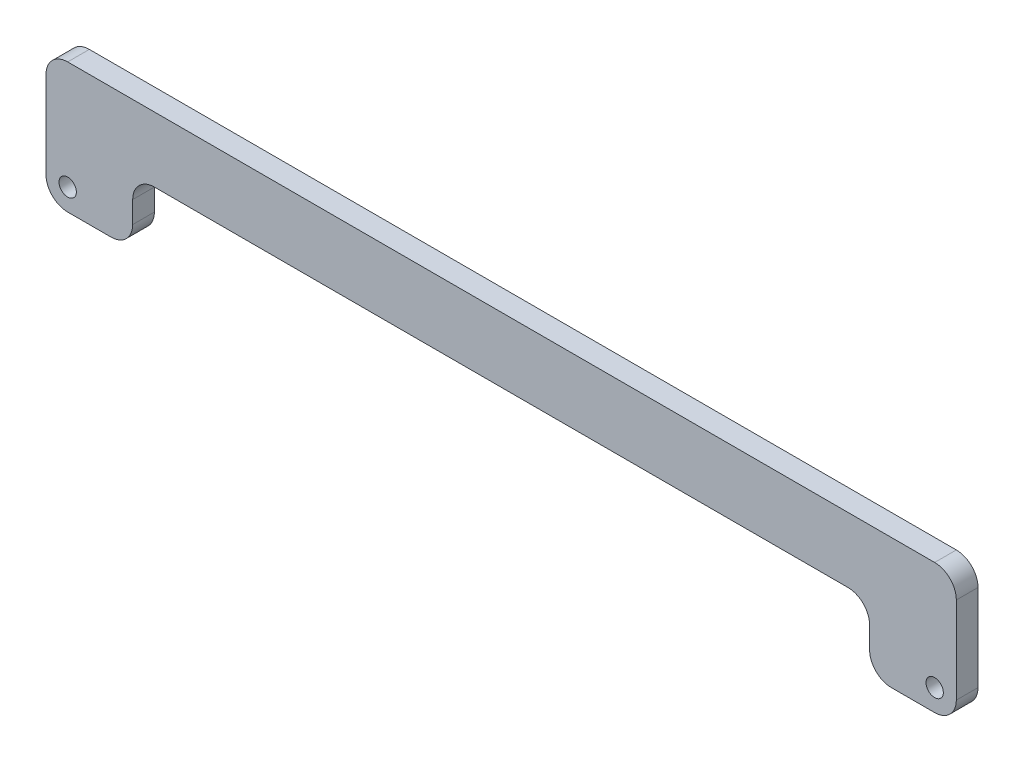
ISO-10303-21;
HEADER;
FILE_DESCRIPTION(('STEP AP214'),'2;1');
FILE_NAME('part.step','',(''),(''),'','','');
FILE_SCHEMA(('AUTOMOTIVE_DESIGN { 1 0 10303 214 1 1 1 1 }'));
ENDSEC;
DATA;
#1=APPLICATION_CONTEXT('core data for automotive mechanical design processes');
#2=APPLICATION_PROTOCOL_DEFINITION('international standard','automotive_design',2000,#1);
#3=PRODUCT_CONTEXT('',#1,'mechanical');
#4=PRODUCT('Part','Part','',(#3));
#5=PRODUCT_RELATED_PRODUCT_CATEGORY('part','',(#4));
#6=PRODUCT_DEFINITION_FORMATION('','',#4);
#7=PRODUCT_DEFINITION_CONTEXT('part definition',#1,'design');
#8=PRODUCT_DEFINITION('design','',#6,#7);
#9=PRODUCT_DEFINITION_SHAPE('','',#8);
#10=(LENGTH_UNIT() NAMED_UNIT(*) SI_UNIT(.MILLI.,.METRE.));
#11=(NAMED_UNIT(*) PLANE_ANGLE_UNIT() SI_UNIT($,.RADIAN.));
#12=(NAMED_UNIT(*) SI_UNIT($,.STERADIAN.) SOLID_ANGLE_UNIT());
#13=UNCERTAINTY_MEASURE_WITH_UNIT(LENGTH_MEASURE(1.E-05),#10,'distance_accuracy_value','');
#14=(GEOMETRIC_REPRESENTATION_CONTEXT(3) GLOBAL_UNCERTAINTY_ASSIGNED_CONTEXT((#13)) GLOBAL_UNIT_ASSIGNED_CONTEXT((#10,
#11,#12)) REPRESENTATION_CONTEXT('',''));
#15=CARTESIAN_POINT('',(0.,0.,0.));
#16=DIRECTION('',(0.,0.,1.));
#17=DIRECTION('',(1.,0.,0.));
#18=AXIS2_PLACEMENT_3D('',#15,#16,#17);
#19=CARTESIAN_POINT('',(0.,0.,5.));
#20=DIRECTION('',(0.,0.,-1.));
#21=DIRECTION('',(-1.,0.,0.));
#22=AXIS2_PLACEMENT_3D('',#19,#20,#21);
#23=PLANE('',#22);
#24=DIRECTION('',(0.,-1.,0.));
#25=VECTOR('',#24,1.);
#26=CARTESIAN_POINT('',(0.,0.,5.));
#27=LINE('',#26,#25);
#28=CARTESIAN_POINT('',(0.,25.,5.));
#29=VERTEX_POINT('',#28);
#30=CARTESIAN_POINT('',(0.,5.,5.));
#31=VERTEX_POINT('',#30);
#32=EDGE_CURVE('E192',#29,#31,#27,.T.);
#33=ORIENTED_EDGE('',*,*,#32,.T.);
#34=CARTESIAN_POINT('',(5.,5.,5.));
#35=DIRECTION('',(0.,0.,-1.));
#36=DIRECTION('',(-1.,0.,0.));
#37=AXIS2_PLACEMENT_3D('',#34,#35,#36);
#38=CIRCLE('',#37,5.);
#39=CARTESIAN_POINT('',(5.,0.,5.));
#40=VERTEX_POINT('',#39);
#41=EDGE_CURVE('E237',#31,#40,#38,.F.);
#42=ORIENTED_EDGE('',*,*,#41,.T.);
#43=DIRECTION('',(1.,0.,0.));
#44=VECTOR('',#43,1.);
#45=CARTESIAN_POINT('',(20.,0.,5.));
#46=LINE('',#45,#44);
#47=CARTESIAN_POINT('',(15.,0.,5.));
#48=VERTEX_POINT('',#47);
#49=EDGE_CURVE('E174',#40,#48,#46,.T.);
#50=ORIENTED_EDGE('',*,*,#49,.T.);
#51=CARTESIAN_POINT('',(15.,5.,5.));
#52=DIRECTION('',(0.,0.,-1.));
#53=DIRECTION('',(-1.,0.,0.));
#54=AXIS2_PLACEMENT_3D('',#51,#52,#53);
#55=CIRCLE('',#54,5.);
#56=CARTESIAN_POINT('',(20.,5.,5.));
#57=VERTEX_POINT('',#56);
#58=EDGE_CURVE('E234',#48,#57,#55,.F.);
#59=ORIENTED_EDGE('',*,*,#58,.T.);
#60=DIRECTION('',(0.,1.,0.));
#61=VECTOR('',#60,1.);
#62=CARTESIAN_POINT('',(20.,15.,5.));
#63=LINE('',#62,#61);
#64=CARTESIAN_POINT('',(20.,9.99999999999998,5.));
#65=VERTEX_POINT('',#64);
#66=EDGE_CURVE('E288',#57,#65,#63,.T.);
#67=ORIENTED_EDGE('',*,*,#66,.T.);
#68=CARTESIAN_POINT('',(25.,9.99999999999998,5.));
#69=DIRECTION('',(0.,0.,-1.));
#70=DIRECTION('',(-1.,0.,0.));
#71=AXIS2_PLACEMENT_3D('',#68,#69,#70);
#72=CIRCLE('',#71,5.);
#73=CARTESIAN_POINT('',(25.,15.,5.));
#74=VERTEX_POINT('',#73);
#75=EDGE_CURVE('E271',#65,#74,#72,.T.);
#76=ORIENTED_EDGE('',*,*,#75,.T.);
#77=DIRECTION('',(1.,0.,0.));
#78=VECTOR('',#77,1.);
#79=CARTESIAN_POINT('',(190.,15.,5.));
#80=LINE('',#79,#78);
#81=CARTESIAN_POINT('',(185.,15.,5.));
#82=VERTEX_POINT('',#81);
#83=EDGE_CURVE('E282',#74,#82,#80,.T.);
#84=ORIENTED_EDGE('',*,*,#83,.T.);
#85=CARTESIAN_POINT('',(185.,10.,5.));
#86=DIRECTION('',(0.,0.,-1.));
#87=DIRECTION('',(-1.,0.,0.));
#88=AXIS2_PLACEMENT_3D('',#85,#86,#87);
#89=CIRCLE('',#88,5.);
#90=CARTESIAN_POINT('',(190.,9.99999999999999,5.));
#91=VERTEX_POINT('',#90);
#92=EDGE_CURVE('E12',#82,#91,#89,.T.);
#93=ORIENTED_EDGE('',*,*,#92,.T.);
#94=DIRECTION('',(0.,-1.,0.));
#95=VECTOR('',#94,1.);
#96=CARTESIAN_POINT('',(190.,0.,5.));
#97=LINE('',#96,#95);
#98=CARTESIAN_POINT('',(190.,5.,5.));
#99=VERTEX_POINT('',#98);
#100=EDGE_CURVE('E287',#91,#99,#97,.T.);
#101=ORIENTED_EDGE('',*,*,#100,.T.);
#102=CARTESIAN_POINT('',(195.,5.,5.));
#103=DIRECTION('',(0.,0.,-1.));
#104=DIRECTION('',(-1.,0.,0.));
#105=AXIS2_PLACEMENT_3D('',#102,#103,#104);
#106=CIRCLE('',#105,5.);
#107=CARTESIAN_POINT('',(195.,0.,5.));
#108=VERTEX_POINT('',#107);
#109=EDGE_CURVE('E228',#99,#108,#106,.F.);
#110=ORIENTED_EDGE('',*,*,#109,.T.);
#111=DIRECTION('',(1.,0.,0.));
#112=VECTOR('',#111,1.);
#113=CARTESIAN_POINT('',(210.,0.,5.));
#114=LINE('',#113,#112);
#115=CARTESIAN_POINT('',(205.,0.,5.));
#116=VERTEX_POINT('',#115);
#117=EDGE_CURVE('E295',#108,#116,#114,.T.);
#118=ORIENTED_EDGE('',*,*,#117,.T.);
#119=CARTESIAN_POINT('',(205.,5.,5.));
#120=DIRECTION('',(0.,0.,-1.));
#121=DIRECTION('',(-1.,0.,0.));
#122=AXIS2_PLACEMENT_3D('',#119,#120,#121);
#123=CIRCLE('',#122,5.);
#124=CARTESIAN_POINT('',(210.,5.,5.));
#125=VERTEX_POINT('',#124);
#126=EDGE_CURVE('E231',#116,#125,#123,.F.);
#127=ORIENTED_EDGE('',*,*,#126,.T.);
#128=DIRECTION('',(0.,1.,0.));
#129=VECTOR('',#128,1.);
#130=CARTESIAN_POINT('',(210.,0.,5.));
#131=LINE('',#130,#129);
#132=CARTESIAN_POINT('',(210.,25.,5.));
#133=VERTEX_POINT('',#132);
#134=EDGE_CURVE('E301',#125,#133,#131,.T.);
#135=ORIENTED_EDGE('',*,*,#134,.T.);
#136=CARTESIAN_POINT('',(205.,25.,5.));
#137=DIRECTION('',(0.,0.,-1.));
#138=DIRECTION('',(-1.,0.,0.));
#139=AXIS2_PLACEMENT_3D('',#136,#137,#138);
#140=CIRCLE('',#139,5.);
#141=CARTESIAN_POINT('',(205.,30.,5.));
#142=VERTEX_POINT('',#141);
#143=EDGE_CURVE('E62',#133,#142,#140,.F.);
#144=ORIENTED_EDGE('',*,*,#143,.T.);
#145=DIRECTION('',(-1.,0.,0.));
#146=VECTOR('',#145,1.);
#147=CARTESIAN_POINT('',(0.,30.,5.));
#148=LINE('',#147,#146);
#149=CARTESIAN_POINT('',(5.,30.,5.));
#150=VERTEX_POINT('',#149);
#151=EDGE_CURVE('E304',#142,#150,#148,.T.);
#152=ORIENTED_EDGE('',*,*,#151,.T.);
#153=CARTESIAN_POINT('',(5.,25.,5.));
#154=DIRECTION('',(0.,0.,-1.));
#155=DIRECTION('',(-1.,0.,0.));
#156=AXIS2_PLACEMENT_3D('',#153,#154,#155);
#157=CIRCLE('',#156,5.);
#158=EDGE_CURVE('E223',#150,#29,#157,.F.);
#159=ORIENTED_EDGE('',*,*,#158,.T.);
#160=EDGE_LOOP('',(#33,#42,#50,#59,#67,#76,#84,#93,#101,#110,#118,#127,#135,#144,#152,#159));
#161=FACE_BOUND('',#160,.T.);
#162=CARTESIAN_POINT('',(5.,5.,5.));
#163=DIRECTION('',(0.,0.,1.));
#164=DIRECTION('',(1.,0.,0.));
#165=AXIS2_PLACEMENT_3D('',#162,#163,#164);
#166=CIRCLE('',#165,2.);
#167=CARTESIAN_POINT('',(7.,5.,5.));
#168=VERTEX_POINT('',#167);
#169=EDGE_CURVE('E182',#168,#168,#166,.T.);
#170=ORIENTED_EDGE('',*,*,#169,.F.);
#171=EDGE_LOOP('',(#170));
#172=FACE_BOUND('',#171,.T.);
#173=CARTESIAN_POINT('',(205.,5.,5.));
#174=DIRECTION('',(0.,0.,1.));
#175=DIRECTION('',(1.,0.,0.));
#176=AXIS2_PLACEMENT_3D('',#173,#174,#175);
#177=CIRCLE('',#176,2.);
#178=CARTESIAN_POINT('',(207.,5.,5.));
#179=VERTEX_POINT('',#178);
#180=EDGE_CURVE('E373',#179,#179,#177,.T.);
#181=ORIENTED_EDGE('',*,*,#180,.F.);
#182=EDGE_LOOP('',(#181));
#183=FACE_BOUND('',#182,.T.);
#184=ADVANCED_FACE('F38',(#161,#172,#183),#23,.F.);
#185=CARTESIAN_POINT('',(0.,0.,0.));
#186=DIRECTION('',(0.,0.,-1.));
#187=DIRECTION('',(-1.,0.,0.));
#188=AXIS2_PLACEMENT_3D('',#185,#186,#187);
#189=PLANE('',#188);
#190=CARTESIAN_POINT('',(5.,5.,0.));
#191=DIRECTION('',(0.,0.,1.));
#192=DIRECTION('',(1.,0.,0.));
#193=AXIS2_PLACEMENT_3D('',#190,#191,#192);
#194=CIRCLE('',#193,2.);
#195=CARTESIAN_POINT('',(7.,5.,0.));
#196=VERTEX_POINT('',#195);
#197=EDGE_CURVE('E189',#196,#196,#194,.T.);
#198=ORIENTED_EDGE('',*,*,#197,.T.);
#199=EDGE_LOOP('',(#198));
#200=FACE_BOUND('',#199,.T.);
#201=DIRECTION('',(1.,0.,0.));
#202=VECTOR('',#201,1.);
#203=CARTESIAN_POINT('',(20.,0.,0.));
#204=LINE('',#203,#202);
#205=CARTESIAN_POINT('',(5.,0.,0.));
#206=VERTEX_POINT('',#205);
#207=CARTESIAN_POINT('',(15.,0.,0.));
#208=VERTEX_POINT('',#207);
#209=EDGE_CURVE('E171',#206,#208,#204,.T.);
#210=ORIENTED_EDGE('',*,*,#209,.F.);
#211=CARTESIAN_POINT('',(5.,5.,0.));
#212=DIRECTION('',(0.,0.,-1.));
#213=DIRECTION('',(-1.,0.,0.));
#214=AXIS2_PLACEMENT_3D('',#211,#212,#213);
#215=CIRCLE('',#214,5.);
#216=CARTESIAN_POINT('',(0.,5.,0.));
#217=VERTEX_POINT('',#216);
#218=EDGE_CURVE('E154',#206,#217,#215,.T.);
#219=ORIENTED_EDGE('',*,*,#218,.T.);
#220=DIRECTION('',(0.,-1.,0.));
#221=VECTOR('',#220,1.);
#222=CARTESIAN_POINT('',(0.,0.,0.));
#223=LINE('',#222,#221);
#224=CARTESIAN_POINT('',(0.,25.,0.));
#225=VERTEX_POINT('',#224);
#226=EDGE_CURVE('E209',#225,#217,#223,.T.);
#227=ORIENTED_EDGE('',*,*,#226,.F.);
#228=CARTESIAN_POINT('',(5.,25.,0.));
#229=DIRECTION('',(0.,0.,-1.));
#230=DIRECTION('',(-1.,0.,0.));
#231=AXIS2_PLACEMENT_3D('',#228,#229,#230);
#232=CIRCLE('',#231,5.);
#233=CARTESIAN_POINT('',(5.,30.,0.));
#234=VERTEX_POINT('',#233);
#235=EDGE_CURVE('E175',#225,#234,#232,.T.);
#236=ORIENTED_EDGE('',*,*,#235,.T.);
#237=DIRECTION('',(-1.,0.,0.));
#238=VECTOR('',#237,1.);
#239=CARTESIAN_POINT('',(0.,30.,0.));
#240=LINE('',#239,#238);
#241=CARTESIAN_POINT('',(205.,30.,0.));
#242=VERTEX_POINT('',#241);
#243=EDGE_CURVE('E207',#242,#234,#240,.T.);
#244=ORIENTED_EDGE('',*,*,#243,.F.);
#245=CARTESIAN_POINT('',(205.,25.,0.));
#246=DIRECTION('',(0.,0.,-1.));
#247=DIRECTION('',(-1.,0.,0.));
#248=AXIS2_PLACEMENT_3D('',#245,#246,#247);
#249=CIRCLE('',#248,5.);
#250=CARTESIAN_POINT('',(210.,25.,0.));
#251=VERTEX_POINT('',#250);
#252=EDGE_CURVE('E213',#242,#251,#249,.T.);
#253=ORIENTED_EDGE('',*,*,#252,.T.);
#254=DIRECTION('',(0.,1.,0.));
#255=VECTOR('',#254,1.);
#256=CARTESIAN_POINT('',(210.,0.,0.));
#257=LINE('',#256,#255);
#258=CARTESIAN_POINT('',(210.,5.,0.));
#259=VERTEX_POINT('',#258);
#260=EDGE_CURVE('E204',#259,#251,#257,.T.);
#261=ORIENTED_EDGE('',*,*,#260,.F.);
#262=CARTESIAN_POINT('',(205.,5.,0.));
#263=DIRECTION('',(0.,0.,-1.));
#264=DIRECTION('',(-1.,0.,0.));
#265=AXIS2_PLACEMENT_3D('',#262,#263,#264);
#266=CIRCLE('',#265,5.);
#267=CARTESIAN_POINT('',(205.,0.,0.));
#268=VERTEX_POINT('',#267);
#269=EDGE_CURVE('E217',#259,#268,#266,.T.);
#270=ORIENTED_EDGE('',*,*,#269,.T.);
#271=DIRECTION('',(1.,0.,0.));
#272=VECTOR('',#271,1.);
#273=CARTESIAN_POINT('',(210.,0.,0.));
#274=LINE('',#273,#272);
#275=CARTESIAN_POINT('',(195.,0.,0.));
#276=VERTEX_POINT('',#275);
#277=EDGE_CURVE('E201',#276,#268,#274,.T.);
#278=ORIENTED_EDGE('',*,*,#277,.F.);
#279=CARTESIAN_POINT('',(195.,5.,0.));
#280=DIRECTION('',(0.,0.,-1.));
#281=DIRECTION('',(-1.,0.,0.));
#282=AXIS2_PLACEMENT_3D('',#279,#280,#281);
#283=CIRCLE('',#282,5.);
#284=CARTESIAN_POINT('',(190.,5.,0.));
#285=VERTEX_POINT('',#284);
#286=EDGE_CURVE('E215',#276,#285,#283,.T.);
#287=ORIENTED_EDGE('',*,*,#286,.T.);
#288=DIRECTION('',(0.,-1.,0.));
#289=VECTOR('',#288,1.);
#290=CARTESIAN_POINT('',(190.,0.,0.));
#291=LINE('',#290,#289);
#292=CARTESIAN_POINT('',(190.,9.99999999999999,0.));
#293=VERTEX_POINT('',#292);
#294=EDGE_CURVE('E198',#293,#285,#291,.T.);
#295=ORIENTED_EDGE('',*,*,#294,.F.);
#296=CARTESIAN_POINT('',(185.,10.,0.));
#297=DIRECTION('',(0.,0.,-1.));
#298=DIRECTION('',(-1.,0.,0.));
#299=AXIS2_PLACEMENT_3D('',#296,#297,#298);
#300=CIRCLE('',#299,5.);
#301=CARTESIAN_POINT('',(185.,15.,0.));
#302=VERTEX_POINT('',#301);
#303=EDGE_CURVE('E48',#293,#302,#300,.F.);
#304=ORIENTED_EDGE('',*,*,#303,.T.);
#305=DIRECTION('',(1.,0.,0.));
#306=VECTOR('',#305,1.);
#307=CARTESIAN_POINT('',(190.,15.,0.));
#308=LINE('',#307,#306);
#309=CARTESIAN_POINT('',(25.,15.,0.));
#310=VERTEX_POINT('',#309);
#311=EDGE_CURVE('E185',#310,#302,#308,.T.);
#312=ORIENTED_EDGE('',*,*,#311,.F.);
#313=CARTESIAN_POINT('',(25.,9.99999999999998,0.));
#314=DIRECTION('',(0.,0.,-1.));
#315=DIRECTION('',(-1.,0.,0.));
#316=AXIS2_PLACEMENT_3D('',#313,#314,#315);
#317=CIRCLE('',#316,5.);
#318=CARTESIAN_POINT('',(20.,9.99999999999998,0.));
#319=VERTEX_POINT('',#318);
#320=EDGE_CURVE('E269',#310,#319,#317,.F.);
#321=ORIENTED_EDGE('',*,*,#320,.T.);
#322=DIRECTION('',(0.,1.,0.));
#323=VECTOR('',#322,1.);
#324=CARTESIAN_POINT('',(20.,15.,0.));
#325=LINE('',#324,#323);
#326=CARTESIAN_POINT('',(20.,5.,0.));
#327=VERTEX_POINT('',#326);
#328=EDGE_CURVE('E181',#327,#319,#325,.T.);
#329=ORIENTED_EDGE('',*,*,#328,.F.);
#330=CARTESIAN_POINT('',(15.,5.,0.));
#331=DIRECTION('',(0.,0.,-1.));
#332=DIRECTION('',(-1.,0.,0.));
#333=AXIS2_PLACEMENT_3D('',#330,#331,#332);
#334=CIRCLE('',#333,5.);
#335=EDGE_CURVE('E165',#327,#208,#334,.T.);
#336=ORIENTED_EDGE('',*,*,#335,.T.);
#337=EDGE_LOOP('',(#210,#219,#227,#236,#244,#253,#261,#270,#278,#287,#295,#304,#312,#321,#329,#336));
#338=FACE_BOUND('',#337,.T.);
#339=CARTESIAN_POINT('',(205.,5.,0.));
#340=DIRECTION('',(0.,0.,1.));
#341=DIRECTION('',(1.,0.,0.));
#342=AXIS2_PLACEMENT_3D('',#339,#340,#341);
#343=CIRCLE('',#342,2.);
#344=CARTESIAN_POINT('',(207.,5.,0.));
#345=VERTEX_POINT('',#344);
#346=EDGE_CURVE('E376',#345,#345,#343,.T.);
#347=ORIENTED_EDGE('',*,*,#346,.T.);
#348=EDGE_LOOP('',(#347));
#349=FACE_BOUND('',#348,.T.);
#350=ADVANCED_FACE('F178',(#200,#338,#349),#189,.T.);
#351=CARTESIAN_POINT('',(20.,0.,5.));
#352=DIRECTION('',(0.,1.,0.));
#353=DIRECTION('',(0.,0.,1.));
#354=AXIS2_PLACEMENT_3D('',#351,#352,#353);
#355=PLANE('',#354);
#356=ORIENTED_EDGE('',*,*,#49,.F.);
#357=DIRECTION('',(0.,0.,-1.));
#358=VECTOR('',#357,1.);
#359=CARTESIAN_POINT('',(5.,0.,5.));
#360=LINE('',#359,#358);
#361=EDGE_CURVE('E158',#40,#206,#360,.T.);
#362=ORIENTED_EDGE('',*,*,#361,.T.);
#363=ORIENTED_EDGE('',*,*,#209,.T.);
#364=DIRECTION('',(0.,0.,-1.));
#365=VECTOR('',#364,1.);
#366=CARTESIAN_POINT('',(15.,0.,5.));
#367=LINE('',#366,#365);
#368=EDGE_CURVE('E176',#208,#48,#367,.F.);
#369=ORIENTED_EDGE('',*,*,#368,.T.);
#370=EDGE_LOOP('',(#356,#362,#363,#369));
#371=FACE_BOUND('',#370,.T.);
#372=ADVANCED_FACE('F170',(#371),#355,.F.);
#373=CARTESIAN_POINT('',(20.,15.,5.));
#374=DIRECTION('',(-1.,0.,0.));
#375=DIRECTION('',(0.,0.,1.));
#376=AXIS2_PLACEMENT_3D('',#373,#374,#375);
#377=PLANE('',#376);
#378=ORIENTED_EDGE('',*,*,#66,.F.);
#379=DIRECTION('',(0.,0.,-1.));
#380=VECTOR('',#379,1.);
#381=CARTESIAN_POINT('',(20.,5.,5.));
#382=LINE('',#381,#380);
#383=EDGE_CURVE('E242',#57,#327,#382,.T.);
#384=ORIENTED_EDGE('',*,*,#383,.T.);
#385=ORIENTED_EDGE('',*,*,#328,.T.);
#386=DIRECTION('',(0.,0.,-1.));
#387=VECTOR('',#386,1.);
#388=CARTESIAN_POINT('',(20.,9.99999999999998,5.));
#389=LINE('',#388,#387);
#390=EDGE_CURVE('E240',#319,#65,#389,.F.);
#391=ORIENTED_EDGE('',*,*,#390,.T.);
#392=EDGE_LOOP('',(#378,#384,#385,#391));
#393=FACE_BOUND('',#392,.T.);
#394=ADVANCED_FACE('F361',(#393),#377,.F.);
#395=CARTESIAN_POINT('',(190.,15.,5.));
#396=DIRECTION('',(0.,1.,0.));
#397=DIRECTION('',(-1.,0.,0.));
#398=AXIS2_PLACEMENT_3D('',#395,#396,#397);
#399=PLANE('',#398);
#400=ORIENTED_EDGE('',*,*,#83,.F.);
#401=DIRECTION('',(0.,0.,-1.));
#402=VECTOR('',#401,1.);
#403=CARTESIAN_POINT('',(25.,15.,0.));
#404=LINE('',#403,#402);
#405=EDGE_CURVE('E247',#74,#310,#404,.T.);
#406=ORIENTED_EDGE('',*,*,#405,.T.);
#407=ORIENTED_EDGE('',*,*,#311,.T.);
#408=DIRECTION('',(0.,0.,-1.));
#409=VECTOR('',#408,1.);
#410=CARTESIAN_POINT('',(185.,15.,5.));
#411=LINE('',#410,#409);
#412=EDGE_CURVE('E245',#302,#82,#411,.F.);
#413=ORIENTED_EDGE('',*,*,#412,.T.);
#414=EDGE_LOOP('',(#400,#406,#407,#413));
#415=FACE_BOUND('',#414,.T.);
#416=ADVANCED_FACE('F353',(#415),#399,.F.);
#417=CARTESIAN_POINT('',(190.,0.,5.));
#418=DIRECTION('',(1.,0.,0.));
#419=DIRECTION('',(0.,0.,-1.));
#420=AXIS2_PLACEMENT_3D('',#417,#418,#419);
#421=PLANE('',#420);
#422=ORIENTED_EDGE('',*,*,#100,.F.);
#423=DIRECTION('',(0.,0.,-1.));
#424=VECTOR('',#423,1.);
#425=CARTESIAN_POINT('',(190.,10.,0.));
#426=LINE('',#425,#424);
#427=EDGE_CURVE('E262',#91,#293,#426,.T.);
#428=ORIENTED_EDGE('',*,*,#427,.T.);
#429=ORIENTED_EDGE('',*,*,#294,.T.);
#430=DIRECTION('',(0.,0.,-1.));
#431=VECTOR('',#430,1.);
#432=CARTESIAN_POINT('',(190.,5.,5.));
#433=LINE('',#432,#431);
#434=EDGE_CURVE('E260',#285,#99,#433,.F.);
#435=ORIENTED_EDGE('',*,*,#434,.T.);
#436=EDGE_LOOP('',(#422,#428,#429,#435));
#437=FACE_BOUND('',#436,.T.);
#438=ADVANCED_FACE('F344',(#437),#421,.F.);
#439=CARTESIAN_POINT('',(210.,0.,5.));
#440=DIRECTION('',(0.,1.,0.));
#441=DIRECTION('',(-1.,0.,0.));
#442=AXIS2_PLACEMENT_3D('',#439,#440,#441);
#443=PLANE('',#442);
#444=ORIENTED_EDGE('',*,*,#277,.T.);
#445=DIRECTION('',(0.,0.,-1.));
#446=VECTOR('',#445,1.);
#447=CARTESIAN_POINT('',(205.,0.,5.));
#448=LINE('',#447,#446);
#449=EDGE_CURVE('E258',#268,#116,#448,.F.);
#450=ORIENTED_EDGE('',*,*,#449,.T.);
#451=ORIENTED_EDGE('',*,*,#117,.F.);
#452=DIRECTION('',(0.,0.,-1.));
#453=VECTOR('',#452,1.);
#454=CARTESIAN_POINT('',(195.,0.,5.));
#455=LINE('',#454,#453);
#456=EDGE_CURVE('E255',#108,#276,#455,.T.);
#457=ORIENTED_EDGE('',*,*,#456,.T.);
#458=EDGE_LOOP('',(#444,#450,#451,#457));
#459=FACE_BOUND('',#458,.T.);
#460=ADVANCED_FACE('F333',(#459),#443,.F.);
#461=CARTESIAN_POINT('',(210.,0.,5.));
#462=DIRECTION('',(-1.,0.,0.));
#463=DIRECTION('',(0.,0.,1.));
#464=AXIS2_PLACEMENT_3D('',#461,#462,#463);
#465=PLANE('',#464);
#466=ORIENTED_EDGE('',*,*,#134,.F.);
#467=DIRECTION('',(0.,0.,-1.));
#468=VECTOR('',#467,1.);
#469=CARTESIAN_POINT('',(210.,5.,5.));
#470=LINE('',#469,#468);
#471=EDGE_CURVE('E252',#125,#259,#470,.T.);
#472=ORIENTED_EDGE('',*,*,#471,.T.);
#473=ORIENTED_EDGE('',*,*,#260,.T.);
#474=DIRECTION('',(0.,0.,-1.));
#475=VECTOR('',#474,1.);
#476=CARTESIAN_POINT('',(210.,25.,5.));
#477=LINE('',#476,#475);
#478=EDGE_CURVE('E250',#251,#133,#477,.F.);
#479=ORIENTED_EDGE('',*,*,#478,.T.);
#480=EDGE_LOOP('',(#466,#472,#473,#479));
#481=FACE_BOUND('',#480,.T.);
#482=ADVANCED_FACE('F325',(#481),#465,.F.);
#483=CARTESIAN_POINT('',(0.,30.,5.));
#484=DIRECTION('',(0.,-1.,0.));
#485=DIRECTION('',(0.,0.,-1.));
#486=AXIS2_PLACEMENT_3D('',#483,#484,#485);
#487=PLANE('',#486);
#488=ORIENTED_EDGE('',*,*,#151,.F.);
#489=DIRECTION('',(0.,0.,-1.));
#490=VECTOR('',#489,1.);
#491=CARTESIAN_POINT('',(205.,30.,5.));
#492=LINE('',#491,#490);
#493=EDGE_CURVE('E266',#142,#242,#492,.T.);
#494=ORIENTED_EDGE('',*,*,#493,.T.);
#495=ORIENTED_EDGE('',*,*,#243,.T.);
#496=DIRECTION('',(0.,0.,-1.));
#497=VECTOR('',#496,1.);
#498=CARTESIAN_POINT('',(5.,30.,5.));
#499=LINE('',#498,#497);
#500=EDGE_CURVE('E55',#234,#150,#499,.F.);
#501=ORIENTED_EDGE('',*,*,#500,.T.);
#502=EDGE_LOOP('',(#488,#494,#495,#501));
#503=FACE_BOUND('',#502,.T.);
#504=ADVANCED_FACE('F317',(#503),#487,.F.);
#505=CARTESIAN_POINT('',(0.,0.,5.));
#506=DIRECTION('',(1.,0.,0.));
#507=DIRECTION('',(0.,0.,-1.));
#508=AXIS2_PLACEMENT_3D('',#505,#506,#507);
#509=PLANE('',#508);
#510=ORIENTED_EDGE('',*,*,#226,.T.);
#511=DIRECTION('',(0.,0.,-1.));
#512=VECTOR('',#511,1.);
#513=CARTESIAN_POINT('',(0.,5.,5.));
#514=LINE('',#513,#512);
#515=EDGE_CURVE('E159',#217,#31,#514,.F.);
#516=ORIENTED_EDGE('',*,*,#515,.T.);
#517=ORIENTED_EDGE('',*,*,#32,.F.);
#518=DIRECTION('',(0.,0.,-1.));
#519=VECTOR('',#518,1.);
#520=CARTESIAN_POINT('',(0.,25.,5.));
#521=LINE('',#520,#519);
#522=EDGE_CURVE('E164',#29,#225,#521,.T.);
#523=ORIENTED_EDGE('',*,*,#522,.T.);
#524=EDGE_LOOP('',(#510,#516,#517,#523));
#525=FACE_BOUND('',#524,.T.);
#526=ADVANCED_FACE('F314',(#525),#509,.F.);
#527=CARTESIAN_POINT('',(5.,5.,5.));
#528=DIRECTION('',(0.,0.,-1.));
#529=DIRECTION('',(-1.,0.,0.));
#530=AXIS2_PLACEMENT_3D('',#527,#528,#529);
#531=CYLINDRICAL_SURFACE('',#530,2.);
#532=ORIENTED_EDGE('',*,*,#169,.T.);
#533=EDGE_LOOP('',(#532));
#534=FACE_BOUND('',#533,.T.);
#535=ORIENTED_EDGE('',*,*,#197,.F.);
#536=EDGE_LOOP('',(#535));
#537=FACE_BOUND('',#536,.T.);
#538=ADVANCED_FACE('F394',(#534,#537),#531,.F.);
#539=CARTESIAN_POINT('',(205.,5.,5.));
#540=DIRECTION('',(0.,0.,-1.));
#541=DIRECTION('',(-1.,0.,0.));
#542=AXIS2_PLACEMENT_3D('',#539,#540,#541);
#543=CYLINDRICAL_SURFACE('',#542,2.);
#544=ORIENTED_EDGE('',*,*,#180,.T.);
#545=EDGE_LOOP('',(#544));
#546=FACE_BOUND('',#545,.T.);
#547=ORIENTED_EDGE('',*,*,#346,.F.);
#548=EDGE_LOOP('',(#547));
#549=FACE_BOUND('',#548,.T.);
#550=ADVANCED_FACE('F383',(#546,#549),#543,.F.);
#551=CARTESIAN_POINT('',(5.,5.,5.));
#552=DIRECTION('',(0.,0.,-1.));
#553=DIRECTION('',(-1.,0.,0.));
#554=AXIS2_PLACEMENT_3D('',#551,#552,#553);
#555=CYLINDRICAL_SURFACE('',#554,5.);
#556=ORIENTED_EDGE('',*,*,#41,.F.);
#557=ORIENTED_EDGE('',*,*,#515,.F.);
#558=ORIENTED_EDGE('',*,*,#218,.F.);
#559=ORIENTED_EDGE('',*,*,#361,.F.);
#560=EDGE_LOOP('',(#556,#557,#558,#559));
#561=FACE_BOUND('',#560,.T.);
#562=ADVANCED_FACE('F157',(#561),#555,.T.);
#563=CARTESIAN_POINT('',(15.,5.,5.));
#564=DIRECTION('',(0.,0.,-1.));
#565=DIRECTION('',(-1.,0.,0.));
#566=AXIS2_PLACEMENT_3D('',#563,#564,#565);
#567=CYLINDRICAL_SURFACE('',#566,5.);
#568=ORIENTED_EDGE('',*,*,#58,.F.);
#569=ORIENTED_EDGE('',*,*,#368,.F.);
#570=ORIENTED_EDGE('',*,*,#335,.F.);
#571=ORIENTED_EDGE('',*,*,#383,.F.);
#572=EDGE_LOOP('',(#568,#569,#570,#571));
#573=FACE_BOUND('',#572,.T.);
#574=ADVANCED_FACE('F366',(#573),#567,.T.);
#575=CARTESIAN_POINT('',(25.,9.99999999999998,5.));
#576=DIRECTION('',(0.,0.,1.));
#577=DIRECTION('',(1.,0.,0.));
#578=AXIS2_PLACEMENT_3D('',#575,#576,#577);
#579=CYLINDRICAL_SURFACE('',#578,5.);
#580=ORIENTED_EDGE('',*,*,#75,.F.);
#581=ORIENTED_EDGE('',*,*,#390,.F.);
#582=ORIENTED_EDGE('',*,*,#320,.F.);
#583=ORIENTED_EDGE('',*,*,#405,.F.);
#584=EDGE_LOOP('',(#580,#581,#582,#583));
#585=FACE_BOUND('',#584,.T.);
#586=ADVANCED_FACE('F357',(#585),#579,.F.);
#587=CARTESIAN_POINT('',(205.,5.,5.));
#588=DIRECTION('',(0.,0.,-1.));
#589=DIRECTION('',(-1.,0.,0.));
#590=AXIS2_PLACEMENT_3D('',#587,#588,#589);
#591=CYLINDRICAL_SURFACE('',#590,5.);
#592=ORIENTED_EDGE('',*,*,#126,.F.);
#593=ORIENTED_EDGE('',*,*,#449,.F.);
#594=ORIENTED_EDGE('',*,*,#269,.F.);
#595=ORIENTED_EDGE('',*,*,#471,.F.);
#596=EDGE_LOOP('',(#592,#593,#594,#595));
#597=FACE_BOUND('',#596,.T.);
#598=ADVANCED_FACE('F329',(#597),#591,.T.);
#599=CARTESIAN_POINT('',(185.,10.,5.));
#600=DIRECTION('',(0.,0.,1.));
#601=DIRECTION('',(1.,0.,0.));
#602=AXIS2_PLACEMENT_3D('',#599,#600,#601);
#603=CYLINDRICAL_SURFACE('',#602,5.);
#604=ORIENTED_EDGE('',*,*,#92,.F.);
#605=ORIENTED_EDGE('',*,*,#412,.F.);
#606=ORIENTED_EDGE('',*,*,#303,.F.);
#607=ORIENTED_EDGE('',*,*,#427,.F.);
#608=EDGE_LOOP('',(#604,#605,#606,#607));
#609=FACE_BOUND('',#608,.T.);
#610=ADVANCED_FACE('F348',(#609),#603,.F.);
#611=CARTESIAN_POINT('',(195.,5.,5.));
#612=DIRECTION('',(0.,0.,-1.));
#613=DIRECTION('',(-1.,0.,0.));
#614=AXIS2_PLACEMENT_3D('',#611,#612,#613);
#615=CYLINDRICAL_SURFACE('',#614,5.);
#616=ORIENTED_EDGE('',*,*,#109,.F.);
#617=ORIENTED_EDGE('',*,*,#434,.F.);
#618=ORIENTED_EDGE('',*,*,#286,.F.);
#619=ORIENTED_EDGE('',*,*,#456,.F.);
#620=EDGE_LOOP('',(#616,#617,#618,#619));
#621=FACE_BOUND('',#620,.T.);
#622=ADVANCED_FACE('F339',(#621),#615,.T.);
#623=CARTESIAN_POINT('',(205.,25.,5.));
#624=DIRECTION('',(0.,0.,-1.));
#625=DIRECTION('',(-1.,0.,0.));
#626=AXIS2_PLACEMENT_3D('',#623,#624,#625);
#627=CYLINDRICAL_SURFACE('',#626,5.);
#628=ORIENTED_EDGE('',*,*,#143,.F.);
#629=ORIENTED_EDGE('',*,*,#478,.F.);
#630=ORIENTED_EDGE('',*,*,#252,.F.);
#631=ORIENTED_EDGE('',*,*,#493,.F.);
#632=EDGE_LOOP('',(#628,#629,#630,#631));
#633=FACE_BOUND('',#632,.T.);
#634=ADVANCED_FACE('F320',(#633),#627,.T.);
#635=CARTESIAN_POINT('',(5.,25.,5.));
#636=DIRECTION('',(0.,0.,-1.));
#637=DIRECTION('',(-1.,0.,0.));
#638=AXIS2_PLACEMENT_3D('',#635,#636,#637);
#639=CYLINDRICAL_SURFACE('',#638,5.);
#640=ORIENTED_EDGE('',*,*,#158,.F.);
#641=ORIENTED_EDGE('',*,*,#500,.F.);
#642=ORIENTED_EDGE('',*,*,#235,.F.);
#643=ORIENTED_EDGE('',*,*,#522,.F.);
#644=EDGE_LOOP('',(#640,#641,#642,#643));
#645=FACE_BOUND('',#644,.T.);
#646=ADVANCED_FACE('F40',(#645),#639,.T.);
#647=CLOSED_SHELL('',(#184,#350,#372,#394,#416,#438,#460,#482,#504,#526,#538,#550,#562,#574,
#586,#598,#610,#622,#634,#646));
#648=MANIFOLD_SOLID_BREP('B2',#647);
#649=ADVANCED_BREP_SHAPE_REPRESENTATION('',(#18,#648),#14);
#650=SHAPE_DEFINITION_REPRESENTATION(#9,#649);
ENDSEC;
END-ISO-10303-21;
